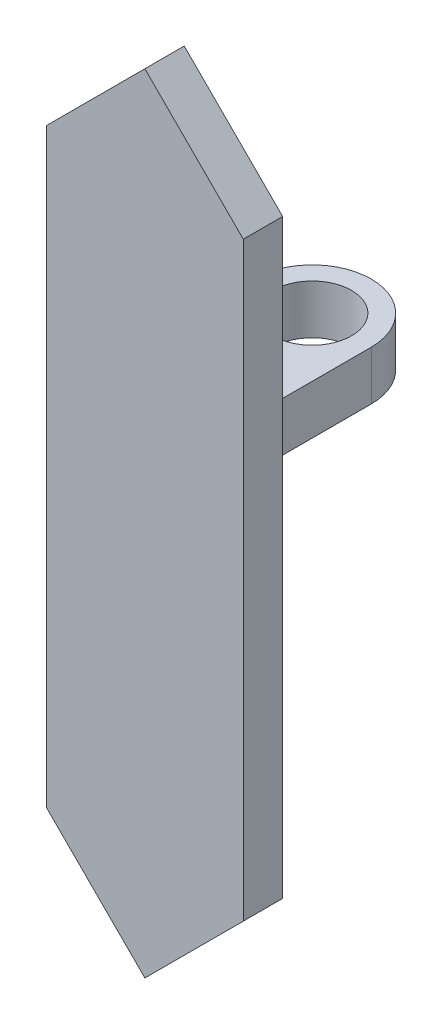
ISO-10303-21;
HEADER;
FILE_DESCRIPTION(('STEP AP214'),'2;1');
FILE_NAME('part.step','',(''),(''),'','','');
FILE_SCHEMA(('AUTOMOTIVE_DESIGN { 1 0 10303 214 1 1 1 1 }'));
ENDSEC;
DATA;
#1=APPLICATION_CONTEXT('core data for automotive mechanical design processes');
#2=APPLICATION_PROTOCOL_DEFINITION('international standard','automotive_design',2000,#1);
#3=PRODUCT_CONTEXT('',#1,'mechanical');
#4=PRODUCT('Part','Part','',(#3));
#5=PRODUCT_RELATED_PRODUCT_CATEGORY('part','',(#4));
#6=PRODUCT_DEFINITION_FORMATION('','',#4);
#7=PRODUCT_DEFINITION_CONTEXT('part definition',#1,'design');
#8=PRODUCT_DEFINITION('design','',#6,#7);
#9=PRODUCT_DEFINITION_SHAPE('','',#8);
#10=(LENGTH_UNIT() NAMED_UNIT(*) SI_UNIT(.MILLI.,.METRE.));
#11=(NAMED_UNIT(*) PLANE_ANGLE_UNIT() SI_UNIT($,.RADIAN.));
#12=(NAMED_UNIT(*) SI_UNIT($,.STERADIAN.) SOLID_ANGLE_UNIT());
#13=UNCERTAINTY_MEASURE_WITH_UNIT(LENGTH_MEASURE(1.E-05),#10,'distance_accuracy_value','');
#14=(GEOMETRIC_REPRESENTATION_CONTEXT(3) GLOBAL_UNCERTAINTY_ASSIGNED_CONTEXT((#13)) GLOBAL_UNIT_ASSIGNED_CONTEXT((#10,
#11,#12)) REPRESENTATION_CONTEXT('',''));
#15=CARTESIAN_POINT('',(0.,0.,0.));
#16=DIRECTION('',(0.,0.,1.));
#17=DIRECTION('',(1.,0.,0.));
#18=AXIS2_PLACEMENT_3D('',#15,#16,#17);
#19=CARTESIAN_POINT('',(4.14728128531616,0.,-20.));
#20=DIRECTION('',(-1.,0.,0.));
#21=DIRECTION('',(0.,0.,1.));
#22=AXIS2_PLACEMENT_3D('',#19,#20,#21);
#23=PLANE('',#22);
#24=DIRECTION('',(0.,0.,1.));
#25=VECTOR('',#24,1.);
#26=CARTESIAN_POINT('',(4.14728128531616,50.,-20.));
#27=LINE('',#26,#25);
#28=CARTESIAN_POINT('',(4.14728128531616,50.,-13.));
#29=VERTEX_POINT('',#28);
#30=CARTESIAN_POINT('',(4.14728128531616,50.,0.));
#31=VERTEX_POINT('',#30);
#32=EDGE_CURVE('E116',#29,#31,#27,.T.);
#33=ORIENTED_EDGE('',*,*,#32,.F.);
#34=DIRECTION('',(0.,-1.,0.));
#35=VECTOR('',#34,1.);
#36=CARTESIAN_POINT('',(4.14728128531616,66.,-13.));
#37=LINE('',#36,#35);
#38=CARTESIAN_POINT('',(4.14728128531616,45.,-13.));
#39=VERTEX_POINT('',#38);
#40=EDGE_CURVE('E171',#29,#39,#37,.T.);
#41=ORIENTED_EDGE('',*,*,#40,.T.);
#42=DIRECTION('',(0.,0.,1.));
#43=VECTOR('',#42,1.);
#44=CARTESIAN_POINT('',(4.14728128531616,45.,-20.));
#45=LINE('',#44,#43);
#46=CARTESIAN_POINT('',(4.14728128531616,45.,0.));
#47=VERTEX_POINT('',#46);
#48=EDGE_CURVE('E179',#39,#47,#45,.T.);
#49=ORIENTED_EDGE('',*,*,#48,.T.);
#50=DIRECTION('',(0.,-1.,0.));
#51=VECTOR('',#50,1.);
#52=CARTESIAN_POINT('',(4.14728128531616,0.,0.));
#53=LINE('',#52,#51);
#54=EDGE_CURVE('E404',#31,#47,#53,.T.);
#55=ORIENTED_EDGE('',*,*,#54,.F.);
#56=EDGE_LOOP('',(#33,#41,#49,#55));
#57=FACE_BOUND('',#56,.T.);
#58=ADVANCED_FACE('F92',(#57),#23,.T.);
#59=CARTESIAN_POINT('',(0.,50.,-20.));
#60=DIRECTION('',(0.,1.,0.));
#61=DIRECTION('',(0.,0.,1.));
#62=AXIS2_PLACEMENT_3D('',#59,#60,#61);
#63=PLANE('',#62);
#64=CARTESIAN_POINT('',(10.1472812853162,50.,-13.));
#65=DIRECTION('',(0.,1.,0.));
#66=DIRECTION('',(0.,0.,1.));
#67=AXIS2_PLACEMENT_3D('',#64,#65,#66);
#68=CIRCLE('',#67,4.);
#69=CARTESIAN_POINT('',(10.1472812853162,50.,-9.));
#70=VERTEX_POINT('',#69);
#71=EDGE_CURVE('E390',#70,#70,#68,.T.);
#72=ORIENTED_EDGE('',*,*,#71,.F.);
#73=EDGE_LOOP('',(#72));
#74=FACE_BOUND('',#73,.T.);
#75=DIRECTION('',(0.,0.,1.));
#76=VECTOR('',#75,1.);
#77=CARTESIAN_POINT('',(16.1472812853161,50.,-20.));
#78=LINE('',#77,#76);
#79=CARTESIAN_POINT('',(16.1472812853161,50.,-13.));
#80=VERTEX_POINT('',#79);
#81=CARTESIAN_POINT('',(16.1472812853161,50.,0.));
#82=VERTEX_POINT('',#81);
#83=EDGE_CURVE('E192',#80,#82,#78,.T.);
#84=ORIENTED_EDGE('',*,*,#83,.F.);
#85=CARTESIAN_POINT('',(10.1472812853162,50.,-13.));
#86=DIRECTION('',(0.,1.,0.));
#87=DIRECTION('',(0.,0.,1.));
#88=AXIS2_PLACEMENT_3D('',#85,#86,#87);
#89=CIRCLE('',#88,6.);
#90=EDGE_CURVE('E398',#80,#29,#89,.T.);
#91=ORIENTED_EDGE('',*,*,#90,.T.);
#92=ORIENTED_EDGE('',*,*,#32,.T.);
#93=DIRECTION('',(-1.,0.,0.));
#94=VECTOR('',#93,1.);
#95=CARTESIAN_POINT('',(0.,50.,0.));
#96=LINE('',#95,#94);
#97=EDGE_CURVE('E407',#82,#31,#96,.T.);
#98=ORIENTED_EDGE('',*,*,#97,.F.);
#99=EDGE_LOOP('',(#84,#91,#92,#98));
#100=FACE_BOUND('',#99,.T.);
#101=ADVANCED_FACE('F304',(#74,#100),#63,.T.);
#102=CARTESIAN_POINT('',(16.1472812853161,0.,-20.));
#103=DIRECTION('',(-1.,0.,0.));
#104=DIRECTION('',(0.,0.,1.));
#105=AXIS2_PLACEMENT_3D('',#102,#103,#104);
#106=PLANE('',#105);
#107=DIRECTION('',(0.,-1.,0.));
#108=VECTOR('',#107,1.);
#109=CARTESIAN_POINT('',(16.1472812853161,66.,-13.));
#110=LINE('',#109,#108);
#111=CARTESIAN_POINT('',(16.1472812853161,45.,-13.));
#112=VERTEX_POINT('',#111);
#113=EDGE_CURVE('E108',#80,#112,#110,.T.);
#114=ORIENTED_EDGE('',*,*,#113,.F.);
#115=ORIENTED_EDGE('',*,*,#83,.T.);
#116=DIRECTION('',(0.,-1.,0.));
#117=VECTOR('',#116,1.);
#118=CARTESIAN_POINT('',(16.1472812853161,0.,0.));
#119=LINE('',#118,#117);
#120=CARTESIAN_POINT('',(16.1472812853161,45.,0.));
#121=VERTEX_POINT('',#120);
#122=EDGE_CURVE('E194',#82,#121,#119,.T.);
#123=ORIENTED_EDGE('',*,*,#122,.T.);
#124=DIRECTION('',(0.,0.,1.));
#125=VECTOR('',#124,1.);
#126=CARTESIAN_POINT('',(16.1472812853161,45.,-20.));
#127=LINE('',#126,#125);
#128=EDGE_CURVE('E188',#112,#121,#127,.T.);
#129=ORIENTED_EDGE('',*,*,#128,.F.);
#130=EDGE_LOOP('',(#114,#115,#123,#129));
#131=FACE_BOUND('',#130,.T.);
#132=ADVANCED_FACE('F297',(#131),#106,.F.);
#133=CARTESIAN_POINT('',(0.,45.,-20.));
#134=DIRECTION('',(0.,1.,0.));
#135=DIRECTION('',(0.,0.,1.));
#136=AXIS2_PLACEMENT_3D('',#133,#134,#135);
#137=PLANE('',#136);
#138=CARTESIAN_POINT('',(10.1472812853162,45.,-13.));
#139=DIRECTION('',(0.,-1.,0.));
#140=DIRECTION('',(0.,0.,-1.));
#141=AXIS2_PLACEMENT_3D('',#138,#139,#140);
#142=CIRCLE('',#141,4.);
#143=CARTESIAN_POINT('',(10.1472812853162,45.,-17.));
#144=VERTEX_POINT('',#143);
#145=EDGE_CURVE('E393',#144,#144,#142,.T.);
#146=ORIENTED_EDGE('',*,*,#145,.F.);
#147=EDGE_LOOP('',(#146));
#148=FACE_BOUND('',#147,.T.);
#149=CARTESIAN_POINT('',(10.1472812853162,45.,-13.));
#150=DIRECTION('',(0.,-1.,0.));
#151=DIRECTION('',(0.,0.,-1.));
#152=AXIS2_PLACEMENT_3D('',#149,#150,#151);
#153=CIRCLE('',#152,6.);
#154=EDGE_CURVE('E168',#39,#112,#153,.T.);
#155=ORIENTED_EDGE('',*,*,#154,.T.);
#156=ORIENTED_EDGE('',*,*,#128,.T.);
#157=DIRECTION('',(-1.,0.,0.));
#158=VECTOR('',#157,1.);
#159=CARTESIAN_POINT('',(0.,45.,0.));
#160=LINE('',#159,#158);
#161=EDGE_CURVE('E186',#121,#47,#160,.T.);
#162=ORIENTED_EDGE('',*,*,#161,.T.);
#163=ORIENTED_EDGE('',*,*,#48,.F.);
#164=EDGE_LOOP('',(#155,#156,#162,#163));
#165=FACE_BOUND('',#164,.T.);
#166=ADVANCED_FACE('F184',(#148,#165),#137,.F.);
#167=CARTESIAN_POINT('',(45.0736406426581,45.0736406426581,4.));
#168=DIRECTION('',(0.707106781186548,0.707106781186547,0.));
#169=DIRECTION('',(-0.707106781186547,0.707106781186548,0.));
#170=AXIS2_PLACEMENT_3D('',#167,#168,#169);
#171=PLANE('',#170);
#172=DIRECTION('',(0.707106781186547,-0.707106781186548,0.));
#173=VECTOR('',#172,1.);
#174=CARTESIAN_POINT('',(45.0736406426581,45.0736406426581,0.));
#175=LINE('',#174,#173);
#176=CARTESIAN_POINT('',(10.1472812853162,80.,0.));
#177=VERTEX_POINT('',#176);
#178=CARTESIAN_POINT('',(20.1472812853162,70.,0.));
#179=VERTEX_POINT('',#178);
#180=EDGE_CURVE('E239',#177,#179,#175,.T.);
#181=ORIENTED_EDGE('',*,*,#180,.F.);
#182=DIRECTION('',(0.,0.,-1.));
#183=VECTOR('',#182,1.);
#184=CARTESIAN_POINT('',(10.1472812853162,80.,4.));
#185=LINE('',#184,#183);
#186=CARTESIAN_POINT('',(10.1472812853162,80.,4.));
#187=VERTEX_POINT('',#186);
#188=EDGE_CURVE('E248',#187,#177,#185,.T.);
#189=ORIENTED_EDGE('',*,*,#188,.F.);
#190=DIRECTION('',(0.707106781186547,-0.707106781186548,0.));
#191=VECTOR('',#190,1.);
#192=CARTESIAN_POINT('',(45.0736406426581,45.0736406426581,4.));
#193=LINE('',#192,#191);
#194=CARTESIAN_POINT('',(20.1472812853162,70.,4.));
#195=VERTEX_POINT('',#194);
#196=EDGE_CURVE('E217',#187,#195,#193,.T.);
#197=ORIENTED_EDGE('',*,*,#196,.T.);
#198=DIRECTION('',(0.,0.,-1.));
#199=VECTOR('',#198,1.);
#200=CARTESIAN_POINT('',(20.1472812853162,70.,4.));
#201=LINE('',#200,#199);
#202=EDGE_CURVE('E251',#195,#179,#201,.T.);
#203=ORIENTED_EDGE('',*,*,#202,.T.);
#204=EDGE_LOOP('',(#181,#189,#197,#203));
#205=FACE_BOUND('',#204,.T.);
#206=ADVANCED_FACE('F288',(#205),#171,.T.);
#207=CARTESIAN_POINT('',(0.,0.,0.));
#208=DIRECTION('',(0.,0.,1.));
#209=DIRECTION('',(1.,0.,0.));
#210=AXIS2_PLACEMENT_3D('',#207,#208,#209);
#211=PLANE('',#210);
#212=ORIENTED_EDGE('',*,*,#97,.T.);
#213=ORIENTED_EDGE('',*,*,#54,.T.);
#214=ORIENTED_EDGE('',*,*,#161,.F.);
#215=ORIENTED_EDGE('',*,*,#122,.F.);
#216=EDGE_LOOP('',(#212,#213,#214,#215));
#217=FACE_BOUND('',#216,.T.);
#218=DIRECTION('',(0.,1.,0.));
#219=VECTOR('',#218,1.);
#220=CARTESIAN_POINT('',(0.147281285316174,0.,0.));
#221=LINE('',#220,#219);
#222=CARTESIAN_POINT('',(0.147281285316174,9.99999999999999,0.));
#223=VERTEX_POINT('',#222);
#224=CARTESIAN_POINT('',(0.147281285316174,70.,0.));
#225=VERTEX_POINT('',#224);
#226=EDGE_CURVE('E202',#223,#225,#221,.T.);
#227=ORIENTED_EDGE('',*,*,#226,.T.);
#228=DIRECTION('',(0.707106781186548,0.707106781186548,0.));
#229=VECTOR('',#228,1.);
#230=CARTESIAN_POINT('',(-34.9263593573419,34.9263593573419,0.));
#231=LINE('',#230,#229);
#232=EDGE_CURVE('E208',#225,#177,#231,.T.);
#233=ORIENTED_EDGE('',*,*,#232,.T.);
#234=ORIENTED_EDGE('',*,*,#180,.T.);
#235=DIRECTION('',(0.,1.,0.));
#236=VECTOR('',#235,1.);
#237=CARTESIAN_POINT('',(20.1472812853162,0.,0.));
#238=LINE('',#237,#236);
#239=CARTESIAN_POINT('',(20.1472812853162,10.,0.));
#240=VERTEX_POINT('',#239);
#241=EDGE_CURVE('E235',#240,#179,#238,.T.);
#242=ORIENTED_EDGE('',*,*,#241,.F.);
#243=DIRECTION('',(0.707106781186548,0.707106781186548,0.));
#244=VECTOR('',#243,1.);
#245=CARTESIAN_POINT('',(5.07364064265808,-5.07364064265808,0.));
#246=LINE('',#245,#244);
#247=CARTESIAN_POINT('',(10.1472812853162,0.,0.));
#248=VERTEX_POINT('',#247);
#249=EDGE_CURVE('E232',#248,#240,#246,.T.);
#250=ORIENTED_EDGE('',*,*,#249,.F.);
#251=DIRECTION('',(0.707106781186548,-0.707106781186548,0.));
#252=VECTOR('',#251,1.);
#253=CARTESIAN_POINT('',(5.07364064265808,5.07364064265808,0.));
#254=LINE('',#253,#252);
#255=EDGE_CURVE('E229',#223,#248,#254,.T.);
#256=ORIENTED_EDGE('',*,*,#255,.F.);
#257=EDGE_LOOP('',(#227,#233,#234,#242,#250,#256));
#258=FACE_BOUND('',#257,.T.);
#259=ADVANCED_FACE('F270',(#217,#258),#211,.F.);
#260=CARTESIAN_POINT('',(20.1472812853162,0.,4.));
#261=DIRECTION('',(-1.,0.,0.));
#262=DIRECTION('',(0.,0.,1.));
#263=AXIS2_PLACEMENT_3D('',#260,#261,#262);
#264=PLANE('',#263);
#265=ORIENTED_EDGE('',*,*,#241,.T.);
#266=ORIENTED_EDGE('',*,*,#202,.F.);
#267=DIRECTION('',(0.,1.,0.));
#268=VECTOR('',#267,1.);
#269=CARTESIAN_POINT('',(20.1472812853162,0.,4.));
#270=LINE('',#269,#268);
#271=CARTESIAN_POINT('',(20.1472812853162,10.,4.));
#272=VERTEX_POINT('',#271);
#273=EDGE_CURVE('E214',#272,#195,#270,.T.);
#274=ORIENTED_EDGE('',*,*,#273,.F.);
#275=DIRECTION('',(0.,0.,-1.));
#276=VECTOR('',#275,1.);
#277=CARTESIAN_POINT('',(20.1472812853162,10.,4.));
#278=LINE('',#277,#276);
#279=EDGE_CURVE('E254',#272,#240,#278,.T.);
#280=ORIENTED_EDGE('',*,*,#279,.T.);
#281=EDGE_LOOP('',(#265,#266,#274,#280));
#282=FACE_BOUND('',#281,.T.);
#283=ADVANCED_FACE('F275',(#282),#264,.F.);
#284=CARTESIAN_POINT('',(5.07364064265808,-5.07364064265808,4.));
#285=DIRECTION('',(-0.707106781186547,0.707106781186547,0.));
#286=DIRECTION('',(-0.707106781186548,-0.707106781186548,0.));
#287=AXIS2_PLACEMENT_3D('',#284,#285,#286);
#288=PLANE('',#287);
#289=ORIENTED_EDGE('',*,*,#249,.T.);
#290=ORIENTED_EDGE('',*,*,#279,.F.);
#291=DIRECTION('',(0.707106781186548,0.707106781186548,0.));
#292=VECTOR('',#291,1.);
#293=CARTESIAN_POINT('',(5.07364064265808,-5.07364064265808,4.));
#294=LINE('',#293,#292);
#295=CARTESIAN_POINT('',(10.1472812853162,0.,4.));
#296=VERTEX_POINT('',#295);
#297=EDGE_CURVE('E211',#296,#272,#294,.T.);
#298=ORIENTED_EDGE('',*,*,#297,.F.);
#299=DIRECTION('',(0.,0.,-1.));
#300=VECTOR('',#299,1.);
#301=CARTESIAN_POINT('',(10.1472812853162,0.,4.));
#302=LINE('',#301,#300);
#303=EDGE_CURVE('E101',#296,#248,#302,.T.);
#304=ORIENTED_EDGE('',*,*,#303,.T.);
#305=EDGE_LOOP('',(#289,#290,#298,#304));
#306=FACE_BOUND('',#305,.T.);
#307=ADVANCED_FACE('F263',(#306),#288,.F.);
#308=CARTESIAN_POINT('',(5.07364064265808,5.07364064265808,4.));
#309=DIRECTION('',(0.707106781186547,0.707106781186547,0.));
#310=DIRECTION('',(-0.707106781186548,0.707106781186548,0.));
#311=AXIS2_PLACEMENT_3D('',#308,#309,#310);
#312=PLANE('',#311);
#313=ORIENTED_EDGE('',*,*,#255,.T.);
#314=ORIENTED_EDGE('',*,*,#303,.F.);
#315=DIRECTION('',(0.707106781186548,-0.707106781186548,0.));
#316=VECTOR('',#315,1.);
#317=CARTESIAN_POINT('',(5.07364064265808,5.07364064265808,4.));
#318=LINE('',#317,#316);
#319=CARTESIAN_POINT('',(0.147281285316174,9.99999999999999,4.));
#320=VERTEX_POINT('',#319);
#321=EDGE_CURVE('E207',#320,#296,#318,.T.);
#322=ORIENTED_EDGE('',*,*,#321,.F.);
#323=DIRECTION('',(0.,0.,-1.));
#324=VECTOR('',#323,1.);
#325=CARTESIAN_POINT('',(0.147281285316174,9.99999999999999,4.));
#326=LINE('',#325,#324);
#327=EDGE_CURVE('E12',#320,#223,#326,.T.);
#328=ORIENTED_EDGE('',*,*,#327,.T.);
#329=EDGE_LOOP('',(#313,#314,#322,#328));
#330=FACE_BOUND('',#329,.T.);
#331=ADVANCED_FACE('F282',(#330),#312,.F.);
#332=CARTESIAN_POINT('',(0.147281285316174,0.,4.));
#333=DIRECTION('',(-1.,0.,0.));
#334=DIRECTION('',(0.,0.,1.));
#335=AXIS2_PLACEMENT_3D('',#332,#333,#334);
#336=PLANE('',#335);
#337=ORIENTED_EDGE('',*,*,#226,.F.);
#338=ORIENTED_EDGE('',*,*,#327,.F.);
#339=DIRECTION('',(0.,1.,0.));
#340=VECTOR('',#339,1.);
#341=CARTESIAN_POINT('',(0.147281285316174,0.,4.));
#342=LINE('',#341,#340);
#343=CARTESIAN_POINT('',(0.147281285316174,70.,4.));
#344=VERTEX_POINT('',#343);
#345=EDGE_CURVE('E203',#320,#344,#342,.T.);
#346=ORIENTED_EDGE('',*,*,#345,.T.);
#347=DIRECTION('',(0.,0.,-1.));
#348=VECTOR('',#347,1.);
#349=CARTESIAN_POINT('',(0.147281285316174,70.,4.));
#350=LINE('',#349,#348);
#351=EDGE_CURVE('E225',#344,#225,#350,.T.);
#352=ORIENTED_EDGE('',*,*,#351,.T.);
#353=EDGE_LOOP('',(#337,#338,#346,#352));
#354=FACE_BOUND('',#353,.T.);
#355=ADVANCED_FACE('F94',(#354),#336,.T.);
#356=CARTESIAN_POINT('',(-34.9263593573419,34.9263593573419,4.));
#357=DIRECTION('',(-0.707106781186547,0.707106781186547,0.));
#358=DIRECTION('',(-0.707106781186548,-0.707106781186548,0.));
#359=AXIS2_PLACEMENT_3D('',#356,#357,#358);
#360=PLANE('',#359);
#361=ORIENTED_EDGE('',*,*,#232,.F.);
#362=ORIENTED_EDGE('',*,*,#351,.F.);
#363=DIRECTION('',(0.707106781186548,0.707106781186548,0.));
#364=VECTOR('',#363,1.);
#365=CARTESIAN_POINT('',(-34.9263593573419,34.9263593573419,4.));
#366=LINE('',#365,#364);
#367=EDGE_CURVE('E221',#344,#187,#366,.T.);
#368=ORIENTED_EDGE('',*,*,#367,.T.);
#369=ORIENTED_EDGE('',*,*,#188,.T.);
#370=EDGE_LOOP('',(#361,#362,#368,#369));
#371=FACE_BOUND('',#370,.T.);
#372=ADVANCED_FACE('F286',(#371),#360,.T.);
#373=CARTESIAN_POINT('',(0.,0.,4.));
#374=DIRECTION('',(0.,0.,1.));
#375=DIRECTION('',(1.,0.,0.));
#376=AXIS2_PLACEMENT_3D('',#373,#374,#375);
#377=PLANE('',#376);
#378=ORIENTED_EDGE('',*,*,#345,.F.);
#379=ORIENTED_EDGE('',*,*,#321,.T.);
#380=ORIENTED_EDGE('',*,*,#297,.T.);
#381=ORIENTED_EDGE('',*,*,#273,.T.);
#382=ORIENTED_EDGE('',*,*,#196,.F.);
#383=ORIENTED_EDGE('',*,*,#367,.F.);
#384=EDGE_LOOP('',(#378,#379,#380,#381,#382,#383));
#385=FACE_BOUND('',#384,.T.);
#386=ADVANCED_FACE('F280',(#385),#377,.T.);
#387=CARTESIAN_POINT('',(10.1472812853162,66.,-13.));
#388=DIRECTION('',(0.,-1.,0.));
#389=DIRECTION('',(0.,0.,-1.));
#390=AXIS2_PLACEMENT_3D('',#387,#388,#389);
#391=CYLINDRICAL_SURFACE('',#390,4.);
#392=ORIENTED_EDGE('',*,*,#71,.T.);
#393=EDGE_LOOP('',(#392));
#394=FACE_BOUND('',#393,.T.);
#395=ORIENTED_EDGE('',*,*,#145,.T.);
#396=EDGE_LOOP('',(#395));
#397=FACE_BOUND('',#396,.T.);
#398=ADVANCED_FACE('F314',(#394,#397),#391,.F.);
#399=CARTESIAN_POINT('',(10.1472812853162,66.,-13.));
#400=DIRECTION('',(0.,-1.,0.));
#401=DIRECTION('',(0.,0.,-1.));
#402=AXIS2_PLACEMENT_3D('',#399,#400,#401);
#403=CYLINDRICAL_SURFACE('',#402,6.);
#404=ORIENTED_EDGE('',*,*,#113,.T.);
#405=ORIENTED_EDGE('',*,*,#154,.F.);
#406=ORIENTED_EDGE('',*,*,#40,.F.);
#407=ORIENTED_EDGE('',*,*,#90,.F.);
#408=EDGE_LOOP('',(#404,#405,#406,#407));
#409=FACE_BOUND('',#408,.T.);
#410=ADVANCED_FACE('F170',(#409),#403,.T.);
#411=CLOSED_SHELL('',(#58,#101,#132,#166,#206,#259,#283,#307,#331,#355,#372,#386,#398,#410));
#412=MANIFOLD_SOLID_BREP('B2',#411);
#413=ADVANCED_BREP_SHAPE_REPRESENTATION('',(#18,#412),#14);
#414=SHAPE_DEFINITION_REPRESENTATION(#9,#413);
ENDSEC;
END-ISO-10303-21;
